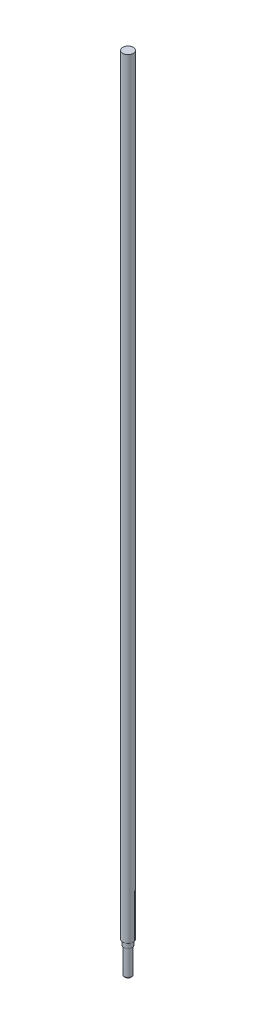
ISO-10303-21;
HEADER;
FILE_DESCRIPTION(('STEP AP214'),'2;1');
FILE_NAME('part.step','',(''),(''),'','','');
FILE_SCHEMA(('AUTOMOTIVE_DESIGN { 1 0 10303 214 1 1 1 1 }'));
ENDSEC;
DATA;
#1=APPLICATION_CONTEXT('core data for automotive mechanical design processes');
#2=APPLICATION_PROTOCOL_DEFINITION('international standard','automotive_design',2000,#1);
#3=PRODUCT_CONTEXT('',#1,'mechanical');
#4=PRODUCT('Part','Part','',(#3));
#5=PRODUCT_RELATED_PRODUCT_CATEGORY('part','',(#4));
#6=PRODUCT_DEFINITION_FORMATION('','',#4);
#7=PRODUCT_DEFINITION_CONTEXT('part definition',#1,'design');
#8=PRODUCT_DEFINITION('design','',#6,#7);
#9=PRODUCT_DEFINITION_SHAPE('','',#8);
#10=(LENGTH_UNIT() NAMED_UNIT(*) SI_UNIT(.MILLI.,.METRE.));
#11=(NAMED_UNIT(*) PLANE_ANGLE_UNIT() SI_UNIT($,.RADIAN.));
#12=(NAMED_UNIT(*) SI_UNIT($,.STERADIAN.) SOLID_ANGLE_UNIT());
#13=UNCERTAINTY_MEASURE_WITH_UNIT(LENGTH_MEASURE(1.E-05),#10,'distance_accuracy_value','');
#14=(GEOMETRIC_REPRESENTATION_CONTEXT(3) GLOBAL_UNCERTAINTY_ASSIGNED_CONTEXT((#13)) GLOBAL_UNIT_ASSIGNED_CONTEXT((#10,
#11,#12)) REPRESENTATION_CONTEXT('',''));
#15=CARTESIAN_POINT('',(0.,0.,0.));
#16=DIRECTION('',(0.,0.,1.));
#17=DIRECTION('',(1.,0.,0.));
#18=AXIS2_PLACEMENT_3D('',#15,#16,#17);
#19=CARTESIAN_POINT('',(0.,7600.,0.));
#20=DIRECTION('',(0.,-1.,0.));
#21=DIRECTION('',(0.,0.,-1.));
#22=AXIS2_PLACEMENT_3D('',#19,#20,#21);
#23=CYLINDRICAL_SURFACE('',#22,50.);
#24=CARTESIAN_POINT('',(0.,300.,0.));
#25=DIRECTION('',(0.,1.,0.));
#26=DIRECTION('',(0.,0.,1.));
#27=AXIS2_PLACEMENT_3D('',#24,#25,#26);
#28=CIRCLE('',#27,50.);
#29=CARTESIAN_POINT('',(0.,300.,-50.));
#30=VERTEX_POINT('',#29);
#31=EDGE_CURVE('E61',#30,#30,#28,.T.);
#32=CARTESIAN_POINT('',(0.,7600.,0.));
#33=DIRECTION('',(0.,1.,0.));
#34=DIRECTION('',(0.,0.,1.));
#35=AXIS2_PLACEMENT_3D('',#32,#33,#34);
#36=CIRCLE('',#35,50.);
#37=CARTESIAN_POINT('',(0.,7600.,-50.));
#38=VERTEX_POINT('',#37);
#39=EDGE_CURVE('E56',#38,#38,#36,.T.);
#40=CARTESIAN_POINT('',(0.,300.,-50.));
#41=CARTESIAN_POINT('',(0.,376.041666666667,-50.));
#42=CARTESIAN_POINT('',(0.,452.083333333333,-50.));
#43=CARTESIAN_POINT('',(0.,604.166666666667,-50.));
#44=CARTESIAN_POINT('',(0.,680.208333333333,-50.));
#45=CARTESIAN_POINT('',(0.,832.291666666666,-50.));
#46=CARTESIAN_POINT('',(0.,908.333333333333,-50.));
#47=CARTESIAN_POINT('',(0.,1060.41666666667,-50.));
#48=CARTESIAN_POINT('',(0.,1136.45833333333,-50.));
#49=CARTESIAN_POINT('',(0.,1288.54166666667,-50.));
#50=CARTESIAN_POINT('',(0.,1364.58333333333,-50.));
#51=CARTESIAN_POINT('',(0.,1516.66666666667,-50.));
#52=CARTESIAN_POINT('',(0.,1592.70833333333,-50.));
#53=CARTESIAN_POINT('',(0.,1744.79166666667,-50.));
#54=CARTESIAN_POINT('',(0.,1820.83333333333,-50.));
#55=CARTESIAN_POINT('',(0.,1972.91666666667,-50.));
#56=CARTESIAN_POINT('',(0.,2048.95833333333,-50.));
#57=CARTESIAN_POINT('',(0.,2201.04166666667,-50.));
#58=CARTESIAN_POINT('',(0.,2277.08333333333,-50.));
#59=CARTESIAN_POINT('',(0.,2429.16666666667,-50.));
#60=CARTESIAN_POINT('',(0.,2505.20833333333,-50.));
#61=CARTESIAN_POINT('',(0.,2657.29166666667,-50.));
#62=CARTESIAN_POINT('',(0.,2733.33333333333,-50.));
#63=CARTESIAN_POINT('',(0.,2885.41666666667,-50.));
#64=CARTESIAN_POINT('',(0.,2961.45833333333,-50.));
#65=CARTESIAN_POINT('',(0.,3113.54166666667,-50.));
#66=CARTESIAN_POINT('',(0.,3189.58333333333,-50.));
#67=CARTESIAN_POINT('',(0.,3341.66666666667,-50.));
#68=CARTESIAN_POINT('',(0.,3417.70833333333,-50.));
#69=CARTESIAN_POINT('',(0.,3569.79166666667,-50.));
#70=CARTESIAN_POINT('',(0.,3645.83333333333,-50.));
#71=CARTESIAN_POINT('',(0.,3797.91666666667,-50.));
#72=CARTESIAN_POINT('',(0.,3873.95833333333,-50.));
#73=CARTESIAN_POINT('',(0.,4026.04166666667,-50.));
#74=CARTESIAN_POINT('',(0.,4102.08333333333,-50.));
#75=CARTESIAN_POINT('',(0.,4254.16666666667,-50.));
#76=CARTESIAN_POINT('',(0.,4330.20833333333,-50.));
#77=CARTESIAN_POINT('',(0.,4482.29166666667,-50.));
#78=CARTESIAN_POINT('',(0.,4558.33333333333,-50.));
#79=CARTESIAN_POINT('',(0.,4710.41666666667,-50.));
#80=CARTESIAN_POINT('',(0.,4786.45833333333,-50.));
#81=CARTESIAN_POINT('',(0.,4938.54166666667,-50.));
#82=CARTESIAN_POINT('',(0.,5014.58333333333,-50.));
#83=CARTESIAN_POINT('',(0.,5166.66666666667,-50.));
#84=CARTESIAN_POINT('',(0.,5242.70833333333,-50.));
#85=CARTESIAN_POINT('',(0.,5394.79166666667,-50.));
#86=CARTESIAN_POINT('',(0.,5470.83333333333,-50.));
#87=CARTESIAN_POINT('',(0.,5622.91666666667,-50.));
#88=CARTESIAN_POINT('',(0.,5698.95833333333,-50.));
#89=CARTESIAN_POINT('',(0.,5851.04166666667,-50.));
#90=CARTESIAN_POINT('',(0.,5927.08333333333,-50.));
#91=CARTESIAN_POINT('',(0.,6079.16666666667,-50.));
#92=CARTESIAN_POINT('',(0.,6155.20833333333,-50.));
#93=CARTESIAN_POINT('',(0.,6307.29166666667,-50.));
#94=CARTESIAN_POINT('',(0.,6383.33333333333,-50.));
#95=CARTESIAN_POINT('',(0.,6535.41666666667,-50.));
#96=CARTESIAN_POINT('',(0.,6611.45833333333,-50.));
#97=CARTESIAN_POINT('',(0.,6763.54166666667,-50.));
#98=CARTESIAN_POINT('',(0.,6839.58333333333,-50.));
#99=CARTESIAN_POINT('',(0.,6991.66666666667,-50.));
#100=CARTESIAN_POINT('',(0.,7067.70833333333,-50.));
#101=CARTESIAN_POINT('',(0.,7219.79166666667,-50.));
#102=CARTESIAN_POINT('',(0.,7295.83333333333,-50.));
#103=CARTESIAN_POINT('',(0.,7447.91666666667,-50.));
#104=CARTESIAN_POINT('',(0.,7523.95833333333,-50.));
#105=CARTESIAN_POINT('',(0.,7600.,-50.));
#106=B_SPLINE_CURVE_WITH_KNOTS('',3,(#40,#41,#42,#43,#44,#45,#46,#47,#48,#49,#50,#51,#52,#53,
#54,#55,#56,#57,#58,#59,#60,#61,#62,#63,#64,#65,#66,#67,#68,#69,#70,#71,#72,#73,#74,#75,#76,#77,
#78,#79,#80,#81,#82,#83,#84,#85,#86,#87,#88,#89,#90,#91,#92,#93,#94,#95,#96,#97,#98,#99,#100,
#101,#102,#103,#104,#105),.UNSPECIFIED.,.F.,.F.,(4,2,2,2,2,2,2,2,2,2,2,2,2,2,2,2,2,2,2,2,2,2,2,
2,2,2,2,2,2,2,2,2,4),(0.,228.125,456.25,684.375,912.5,1140.625,1368.75,1596.875,1825.,2053.125,
2281.25,2509.375,2737.5,2965.625,3193.75,3421.875,3650.,3878.125,4106.25,4334.375,4562.5,
4790.625,5018.75,5246.875,5475.,5703.125,5931.25,6159.375,6387.5,6615.625,6843.75,7071.875,
7300.),.UNSPECIFIED.);
#107=EDGE_CURVE('BSEAM43',#30,#38,#106,.T.);
#108=ORIENTED_EDGE('',*,*,#31,.T.);
#109=ORIENTED_EDGE('',*,*,#39,.F.);
#110=ORIENTED_EDGE('',*,*,#107,.T.);
#111=ORIENTED_EDGE('',*,*,#107,.F.);
#112=EDGE_LOOP('',(#108,#110,#109,#111));
#113=FACE_BOUND('',#112,.T.);
#114=ADVANCED_FACE('F43',(#113),#23,.T.);
#115=CARTESIAN_POINT('',(0.,7600.,0.));
#116=DIRECTION('',(0.,1.,0.));
#117=DIRECTION('',(0.,0.,1.));
#118=AXIS2_PLACEMENT_3D('',#115,#116,#117);
#119=PLANE('',#118);
#120=ORIENTED_EDGE('',*,*,#39,.T.);
#121=EDGE_LOOP('',(#120));
#122=FACE_BOUND('',#121,.T.);
#123=ADVANCED_FACE('F95',(#122),#119,.T.);
#124=CARTESIAN_POINT('',(0.,300.,0.));
#125=DIRECTION('',(0.,1.,0.));
#126=DIRECTION('',(0.,0.,1.));
#127=AXIS2_PLACEMENT_3D('',#124,#125,#126);
#128=PLANE('',#127);
#129=CARTESIAN_POINT('',(0.,300.,0.));
#130=DIRECTION('',(0.,1.,0.));
#131=DIRECTION('',(0.,0.,1.));
#132=AXIS2_PLACEMENT_3D('',#129,#130,#131);
#133=CIRCLE('',#132,40.);
#134=CARTESIAN_POINT('',(0.,300.,40.));
#135=VERTEX_POINT('',#134);
#136=EDGE_CURVE('E67',#135,#135,#133,.T.);
#137=ORIENTED_EDGE('',*,*,#136,.T.);
#138=EDGE_LOOP('',(#137));
#139=FACE_BOUND('',#138,.T.);
#140=ORIENTED_EDGE('',*,*,#31,.F.);
#141=EDGE_LOOP('',(#140));
#142=FACE_BOUND('',#141,.T.);
#143=ADVANCED_FACE('F101',(#139,#142),#128,.F.);
#144=CARTESIAN_POINT('',(0.,0.,0.));
#145=DIRECTION('',(0.,1.,0.));
#146=DIRECTION('',(0.,0.,1.));
#147=AXIS2_PLACEMENT_3D('',#144,#145,#146);
#148=CYLINDRICAL_SURFACE('',#147,40.);
#149=CARTESIAN_POINT('',(0.,250.,0.));
#150=DIRECTION('',(0.,1.,0.));
#151=DIRECTION('',(0.,0.,1.));
#152=AXIS2_PLACEMENT_3D('',#149,#150,#151);
#153=CIRCLE('',#152,40.);
#154=CARTESIAN_POINT('',(0.,250.,40.));
#155=VERTEX_POINT('',#154);
#156=EDGE_CURVE('E71',#155,#155,#153,.T.);
#157=ORIENTED_EDGE('',*,*,#156,.T.);
#158=EDGE_LOOP('',(#157));
#159=FACE_BOUND('',#158,.T.);
#160=ORIENTED_EDGE('',*,*,#136,.F.);
#161=EDGE_LOOP('',(#160));
#162=FACE_BOUND('',#161,.T.);
#163=ADVANCED_FACE('F92',(#159,#162),#148,.T.);
#164=CARTESIAN_POINT('',(0.,250.,0.));
#165=DIRECTION('',(0.,1.,0.));
#166=DIRECTION('',(0.,0.,1.));
#167=AXIS2_PLACEMENT_3D('',#164,#165,#166);
#168=PLANE('',#167);
#169=CARTESIAN_POINT('',(0.,250.,0.));
#170=DIRECTION('',(0.,1.,0.));
#171=DIRECTION('',(0.,0.,1.));
#172=AXIS2_PLACEMENT_3D('',#169,#170,#171);
#173=CIRCLE('',#172,35.);
#174=CARTESIAN_POINT('',(0.,250.,35.));
#175=VERTEX_POINT('',#174);
#176=EDGE_CURVE('E75',#175,#175,#173,.T.);
#177=ORIENTED_EDGE('',*,*,#176,.T.);
#178=EDGE_LOOP('',(#177));
#179=FACE_BOUND('',#178,.T.);
#180=ORIENTED_EDGE('',*,*,#156,.F.);
#181=EDGE_LOOP('',(#180));
#182=FACE_BOUND('',#181,.T.);
#183=ADVANCED_FACE('F80',(#179,#182),#168,.F.);
#184=CARTESIAN_POINT('',(0.,0.,0.));
#185=DIRECTION('',(0.,1.,0.));
#186=DIRECTION('',(0.,0.,1.));
#187=AXIS2_PLACEMENT_3D('',#184,#185,#186);
#188=CYLINDRICAL_SURFACE('',#187,35.);
#189=CARTESIAN_POINT('',(0.,10.,0.));
#190=DIRECTION('',(0.,1.,0.));
#191=DIRECTION('',(0.,0.,1.));
#192=AXIS2_PLACEMENT_3D('',#189,#190,#191);
#193=CIRCLE('',#192,35.);
#194=CARTESIAN_POINT('',(0.,10.,35.));
#195=VERTEX_POINT('',#194);
#196=EDGE_CURVE('E51',#195,#195,#193,.T.);
#197=ORIENTED_EDGE('',*,*,#196,.T.);
#198=EDGE_LOOP('',(#197));
#199=FACE_BOUND('',#198,.T.);
#200=ORIENTED_EDGE('',*,*,#176,.F.);
#201=EDGE_LOOP('',(#200));
#202=FACE_BOUND('',#201,.T.);
#203=ADVANCED_FACE('F83',(#199,#202),#188,.T.);
#204=CARTESIAN_POINT('',(0.,0.,0.));
#205=DIRECTION('',(0.,1.,0.));
#206=DIRECTION('',(0.,0.,1.));
#207=AXIS2_PLACEMENT_3D('',#204,#205,#206);
#208=PLANE('',#207);
#209=CARTESIAN_POINT('',(0.,0.,0.));
#210=DIRECTION('',(0.,1.,0.));
#211=DIRECTION('',(0.,0.,1.));
#212=AXIS2_PLACEMENT_3D('',#209,#210,#211);
#213=CIRCLE('',#212,25.);
#214=CARTESIAN_POINT('',(0.,0.,25.));
#215=VERTEX_POINT('',#214);
#216=EDGE_CURVE('E10',#215,#215,#213,.F.);
#217=ORIENTED_EDGE('',*,*,#216,.T.);
#218=EDGE_LOOP('',(#217));
#219=FACE_BOUND('',#218,.T.);
#220=ADVANCED_FACE('F85',(#219),#208,.F.);
#221=CARTESIAN_POINT('',(0.,10.,0.));
#222=DIRECTION('',(0.,1.,0.));
#223=DIRECTION('',(0.,0.,1.));
#224=AXIS2_PLACEMENT_3D('',#221,#222,#223);
#225=TOROIDAL_SURFACE('',#224,25.,10.);
#226=ORIENTED_EDGE('',*,*,#216,.F.);
#227=EDGE_LOOP('',(#226));
#228=FACE_BOUND('',#227,.T.);
#229=ORIENTED_EDGE('',*,*,#196,.F.);
#230=EDGE_LOOP('',(#229));
#231=FACE_BOUND('',#230,.T.);
#232=ADVANCED_FACE('F45',(#228,#231),#225,.T.);
#233=CLOSED_SHELL('',(#114,#123,#143,#163,#183,#203,#220,#232));
#234=MANIFOLD_SOLID_BREP('B2',#233);
#235=ADVANCED_BREP_SHAPE_REPRESENTATION('',(#18,#234),#14);
#236=SHAPE_DEFINITION_REPRESENTATION(#9,#235);
ENDSEC;
END-ISO-10303-21;
